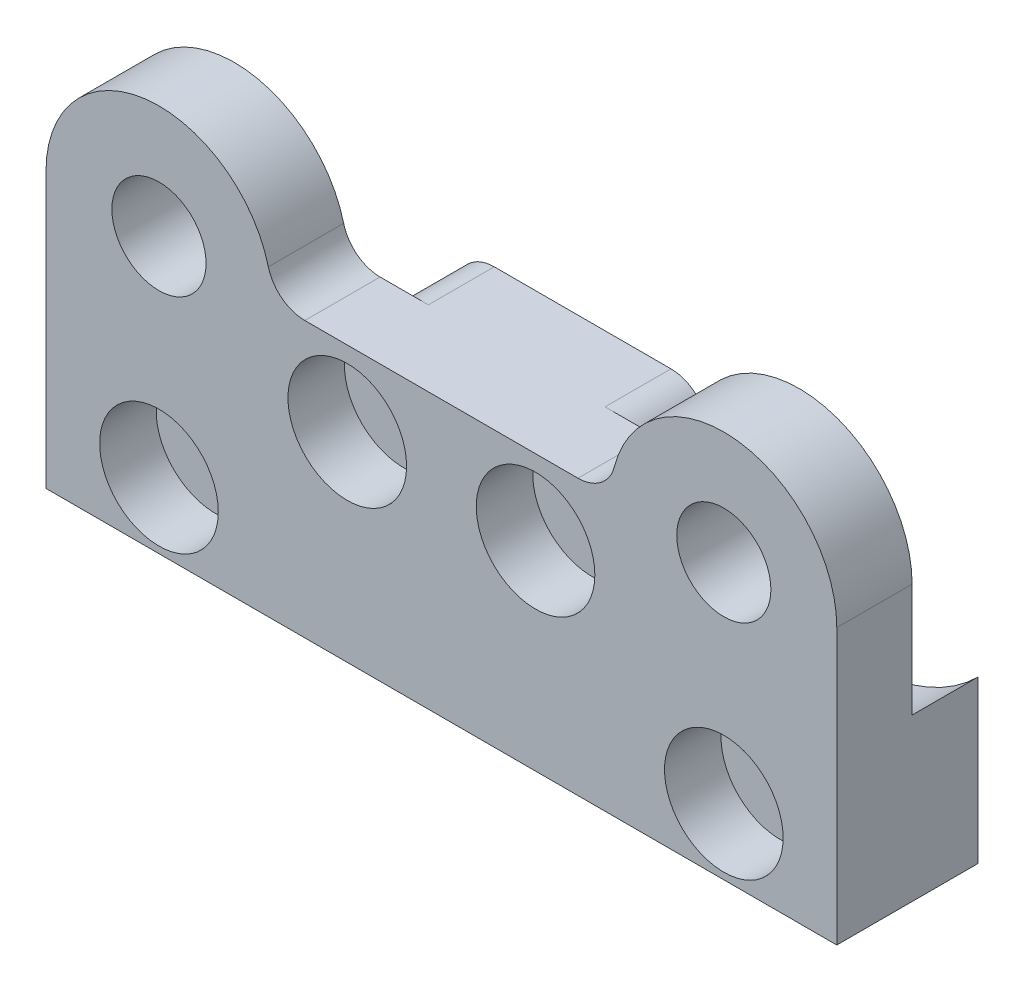
ISO-10303-21;
HEADER;
FILE_DESCRIPTION(('STEP AP214'),'2;1');
FILE_NAME('part.step','',(''),(''),'','','');
FILE_SCHEMA(('AUTOMOTIVE_DESIGN { 1 0 10303 214 1 1 1 1 }'));
ENDSEC;
DATA;
#1=APPLICATION_CONTEXT('core data for automotive mechanical design processes');
#2=APPLICATION_PROTOCOL_DEFINITION('international standard','automotive_design',2000,#1);
#3=PRODUCT_CONTEXT('',#1,'mechanical');
#4=PRODUCT('Part','Part','',(#3));
#5=PRODUCT_RELATED_PRODUCT_CATEGORY('part','',(#4));
#6=PRODUCT_DEFINITION_FORMATION('','',#4);
#7=PRODUCT_DEFINITION_CONTEXT('part definition',#1,'design');
#8=PRODUCT_DEFINITION('design','',#6,#7);
#9=PRODUCT_DEFINITION_SHAPE('','',#8);
#10=(LENGTH_UNIT() NAMED_UNIT(*) SI_UNIT(.MILLI.,.METRE.));
#11=(NAMED_UNIT(*) PLANE_ANGLE_UNIT() SI_UNIT($,.RADIAN.));
#12=(NAMED_UNIT(*) SI_UNIT($,.STERADIAN.) SOLID_ANGLE_UNIT());
#13=UNCERTAINTY_MEASURE_WITH_UNIT(LENGTH_MEASURE(1.E-05),#10,'distance_accuracy_value','');
#14=(GEOMETRIC_REPRESENTATION_CONTEXT(3) GLOBAL_UNCERTAINTY_ASSIGNED_CONTEXT((#13)) GLOBAL_UNIT_ASSIGNED_CONTEXT((#10,
#11,#12)) REPRESENTATION_CONTEXT('',''));
#15=CARTESIAN_POINT('',(0.,0.,0.));
#16=DIRECTION('',(0.,0.,1.));
#17=DIRECTION('',(1.,0.,0.));
#18=AXIS2_PLACEMENT_3D('',#15,#16,#17);
#19=CARTESIAN_POINT('',(-5.00000000000001,-45.3642357598929,4.));
#20=DIRECTION('',(0.,0.,-1.));
#21=DIRECTION('',(-1.,0.,0.));
#22=AXIS2_PLACEMENT_3D('',#19,#20,#21);
#23=CYLINDRICAL_SURFACE('',#22,1.6);
#24=CARTESIAN_POINT('',(-5.00000000000001,-45.3642357598929,-3.5));
#25=DIRECTION('',(0.,0.,-1.));
#26=DIRECTION('',(1.,0.,0.));
#27=AXIS2_PLACEMENT_3D('',#24,#25,#26);
#28=CIRCLE('',#27,1.6);
#29=CARTESIAN_POINT('',(-3.40000000000001,-45.3642357598929,-3.5));
#30=VERTEX_POINT('',#29);
#31=EDGE_CURVE('E435',#30,#30,#28,.T.);
#32=ORIENTED_EDGE('',*,*,#31,.T.);
#33=EDGE_LOOP('',(#32));
#34=FACE_BOUND('',#33,.T.);
#35=CARTESIAN_POINT('',(-5.00000000000001,-45.3642357598929,0.6));
#36=DIRECTION('',(0.,0.,1.));
#37=DIRECTION('',(1.,0.,0.));
#38=AXIS2_PLACEMENT_3D('',#35,#36,#37);
#39=CIRCLE('',#38,1.6);
#40=CARTESIAN_POINT('',(-3.40000000000001,-45.3642357598929,0.6));
#41=VERTEX_POINT('',#40);
#42=EDGE_CURVE('E11',#41,#41,#39,.F.);
#43=ORIENTED_EDGE('',*,*,#42,.F.);
#44=EDGE_LOOP('',(#43));
#45=FACE_BOUND('',#44,.T.);
#46=ADVANCED_FACE('F37',(#34,#45),#23,.F.);
#47=CARTESIAN_POINT('',(-15.,-52.4642357598929,4.));
#48=DIRECTION('',(0.,0.,-1.));
#49=DIRECTION('',(-1.,0.,0.));
#50=AXIS2_PLACEMENT_3D('',#47,#48,#49);
#51=CYLINDRICAL_SURFACE('',#50,1.60000000000001);
#52=CARTESIAN_POINT('',(-15.,-52.4642357598929,-3.5));
#53=DIRECTION('',(0.,0.,-1.));
#54=DIRECTION('',(1.,0.,0.));
#55=AXIS2_PLACEMENT_3D('',#52,#53,#54);
#56=CIRCLE('',#55,1.60000000000001);
#57=CARTESIAN_POINT('',(-13.4,-52.4642357598929,-3.5));
#58=VERTEX_POINT('',#57);
#59=EDGE_CURVE('E438',#58,#58,#56,.T.);
#60=ORIENTED_EDGE('',*,*,#59,.T.);
#61=EDGE_LOOP('',(#60));
#62=FACE_BOUND('',#61,.T.);
#63=CARTESIAN_POINT('',(-15.,-52.4642357598929,0.6));
#64=DIRECTION('',(0.,0.,1.));
#65=DIRECTION('',(1.,0.,0.));
#66=AXIS2_PLACEMENT_3D('',#63,#64,#65);
#67=CIRCLE('',#66,1.60000000000001);
#68=CARTESIAN_POINT('',(-13.4,-52.4642357598929,0.6));
#69=VERTEX_POINT('',#68);
#70=EDGE_CURVE('E45',#69,#69,#67,.F.);
#71=ORIENTED_EDGE('',*,*,#70,.F.);
#72=EDGE_LOOP('',(#71));
#73=FACE_BOUND('',#72,.T.);
#74=ADVANCED_FACE('F289',(#62,#73),#51,.F.);
#75=CARTESIAN_POINT('',(4.99999999999999,-45.3642357598929,4.));
#76=DIRECTION('',(0.,0.,-1.));
#77=DIRECTION('',(-1.,0.,0.));
#78=AXIS2_PLACEMENT_3D('',#75,#76,#77);
#79=CYLINDRICAL_SURFACE('',#78,1.6);
#80=CARTESIAN_POINT('',(4.99999999999999,-45.3642357598929,-3.5));
#81=DIRECTION('',(0.,0.,-1.));
#82=DIRECTION('',(-1.,0.,0.));
#83=AXIS2_PLACEMENT_3D('',#80,#81,#82);
#84=CIRCLE('',#83,1.6);
#85=CARTESIAN_POINT('',(3.39999999999999,-45.3642357598929,-3.5));
#86=VERTEX_POINT('',#85);
#87=EDGE_CURVE('E176',#86,#86,#84,.T.);
#88=ORIENTED_EDGE('',*,*,#87,.T.);
#89=EDGE_LOOP('',(#88));
#90=FACE_BOUND('',#89,.T.);
#91=CARTESIAN_POINT('',(4.99999999999999,-45.3642357598929,0.6));
#92=DIRECTION('',(0.,0.,1.));
#93=DIRECTION('',(1.,0.,0.));
#94=AXIS2_PLACEMENT_3D('',#91,#92,#93);
#95=CIRCLE('',#94,1.6);
#96=CARTESIAN_POINT('',(6.59999999999999,-45.3642357598929,0.6));
#97=VERTEX_POINT('',#96);
#98=EDGE_CURVE('E282',#97,#97,#95,.F.);
#99=ORIENTED_EDGE('',*,*,#98,.F.);
#100=EDGE_LOOP('',(#99));
#101=FACE_BOUND('',#100,.T.);
#102=ADVANCED_FACE('F291',(#90,#101),#79,.F.);
#103=CARTESIAN_POINT('',(15.,-52.4642357598929,4.));
#104=DIRECTION('',(0.,0.,-1.));
#105=DIRECTION('',(-1.,0.,0.));
#106=AXIS2_PLACEMENT_3D('',#103,#104,#105);
#107=CYLINDRICAL_SURFACE('',#106,1.6);
#108=CARTESIAN_POINT('',(15.,-52.4642357598929,-3.5));
#109=DIRECTION('',(0.,0.,-1.));
#110=DIRECTION('',(-1.,0.,0.));
#111=AXIS2_PLACEMENT_3D('',#108,#109,#110);
#112=CIRCLE('',#111,1.6);
#113=CARTESIAN_POINT('',(13.4,-52.4642357598929,-3.5));
#114=VERTEX_POINT('',#113);
#115=EDGE_CURVE('E434',#114,#114,#112,.T.);
#116=ORIENTED_EDGE('',*,*,#115,.T.);
#117=EDGE_LOOP('',(#116));
#118=FACE_BOUND('',#117,.T.);
#119=CARTESIAN_POINT('',(15.,-52.4642357598929,0.6));
#120=DIRECTION('',(0.,0.,1.));
#121=DIRECTION('',(1.,0.,0.));
#122=AXIS2_PLACEMENT_3D('',#119,#120,#121);
#123=CIRCLE('',#122,1.6);
#124=CARTESIAN_POINT('',(16.6,-52.4642357598929,0.6));
#125=VERTEX_POINT('',#124);
#126=EDGE_CURVE('E279',#125,#125,#123,.F.);
#127=ORIENTED_EDGE('',*,*,#126,.F.);
#128=EDGE_LOOP('',(#127));
#129=FACE_BOUND('',#128,.T.);
#130=ADVANCED_FACE('F298',(#118,#129),#107,.F.);
#131=CARTESIAN_POINT('',(0.,0.,0.));
#132=DIRECTION('',(0.,0.,1.));
#133=DIRECTION('',(1.,0.,0.));
#134=AXIS2_PLACEMENT_3D('',#131,#132,#133);
#135=PLANE('',#134);
#136=CARTESIAN_POINT('',(-15.,-41.3642357598929,0.));
#137=DIRECTION('',(0.,0.,1.));
#138=DIRECTION('',(1.,0.,0.));
#139=AXIS2_PLACEMENT_3D('',#136,#137,#138);
#140=CIRCLE('',#139,4.25);
#141=CARTESIAN_POINT('',(-10.75,-41.3642357598929,0.));
#142=VERTEX_POINT('',#141);
#143=EDGE_CURVE('E231',#142,#142,#140,.F.);
#144=ORIENTED_EDGE('',*,*,#143,.F.);
#145=EDGE_LOOP('',(#144));
#146=FACE_BOUND('',#145,.T.);
#147=CARTESIAN_POINT('',(-15.,-41.3642357598929,0.));
#148=DIRECTION('',(0.,0.,1.));
#149=DIRECTION('',(1.,0.,0.));
#150=AXIS2_PLACEMENT_3D('',#147,#148,#149);
#151=CIRCLE('',#150,6.);
#152=CARTESIAN_POINT('',(-21.,-41.3642357598929,0.));
#153=VERTEX_POINT('',#152);
#154=CARTESIAN_POINT('',(-9.19052498068888,-39.8642357598929,0.));
#155=VERTEX_POINT('',#154);
#156=EDGE_CURVE('E211',#153,#155,#151,.F.);
#157=ORIENTED_EDGE('',*,*,#156,.T.);
#158=CARTESIAN_POINT('',(-7.25403330758517,-39.3642357598929,0.));
#159=DIRECTION('',(0.,0.,1.));
#160=DIRECTION('',(1.,0.,0.));
#161=AXIS2_PLACEMENT_3D('',#158,#159,#160);
#162=CIRCLE('',#161,2.);
#163=CARTESIAN_POINT('',(-7.25403330758517,-41.3642357598929,0.));
#164=VERTEX_POINT('',#163);
#165=EDGE_CURVE('E272',#155,#164,#162,.T.);
#166=ORIENTED_EDGE('',*,*,#165,.T.);
#167=DIRECTION('',(1.,0.,0.));
#168=VECTOR('',#167,1.);
#169=CARTESIAN_POINT('',(0.,-41.3642357598929,0.));
#170=LINE('',#169,#168);
#171=CARTESIAN_POINT('',(-4.69223593595586,-41.3642357598929,0.));
#172=VERTEX_POINT('',#171);
#173=EDGE_CURVE('E209',#164,#172,#170,.T.);
#174=ORIENTED_EDGE('',*,*,#173,.T.);
#175=CARTESIAN_POINT('',(-4.69223593595586,-43.3642357598929,0.));
#176=DIRECTION('',(0.,0.,1.));
#177=DIRECTION('',(1.,0.,0.));
#178=AXIS2_PLACEMENT_3D('',#175,#176,#177);
#179=CIRCLE('',#178,2.);
#180=CARTESIAN_POINT('',(-6.65561956720237,-42.9832833789405,0.));
#181=VERTEX_POINT('',#180);
#182=EDGE_CURVE('E276',#172,#181,#179,.T.);
#183=ORIENTED_EDGE('',*,*,#182,.T.);
#184=CARTESIAN_POINT('',(-15.,-41.3642357598929,0.));
#185=DIRECTION('',(0.,0.,-1.));
#186=DIRECTION('',(-1.,0.,0.));
#187=AXIS2_PLACEMENT_3D('',#184,#185,#186);
#188=CIRCLE('',#187,8.5);
#189=CARTESIAN_POINT('',(-21.,-47.3850330492891,0.));
#190=VERTEX_POINT('',#189);
#191=EDGE_CURVE('E174',#181,#190,#188,.T.);
#192=ORIENTED_EDGE('',*,*,#191,.T.);
#193=DIRECTION('',(0.,-1.,0.));
#194=VECTOR('',#193,1.);
#195=CARTESIAN_POINT('',(-21.,0.,0.));
#196=LINE('',#195,#194);
#197=EDGE_CURVE('E214',#153,#190,#196,.T.);
#198=ORIENTED_EDGE('',*,*,#197,.F.);
#199=EDGE_LOOP('',(#157,#166,#174,#183,#192,#198));
#200=FACE_BOUND('',#199,.T.);
#201=ADVANCED_FACE('F342',(#146,#200),#135,.F.);
#202=CARTESIAN_POINT('',(15.,-41.3642357598929,0.));
#203=DIRECTION('',(0.,0.,1.));
#204=DIRECTION('',(1.,0.,0.));
#205=AXIS2_PLACEMENT_3D('',#202,#203,#204);
#206=CIRCLE('',#205,4.25);
#207=CARTESIAN_POINT('',(19.25,-41.3642357598929,0.));
#208=VERTEX_POINT('',#207);
#209=EDGE_CURVE('E228',#208,#208,#206,.F.);
#210=ORIENTED_EDGE('',*,*,#209,.F.);
#211=EDGE_LOOP('',(#210));
#212=FACE_BOUND('',#211,.T.);
#213=DIRECTION('',(0.,1.,0.));
#214=VECTOR('',#213,1.);
#215=CARTESIAN_POINT('',(21.,0.,0.));
#216=LINE('',#215,#214);
#217=CARTESIAN_POINT('',(21.,-47.385033049289,0.));
#218=VERTEX_POINT('',#217);
#219=CARTESIAN_POINT('',(21.,-41.3642357598929,0.));
#220=VERTEX_POINT('',#219);
#221=EDGE_CURVE('E217',#218,#220,#216,.T.);
#222=ORIENTED_EDGE('',*,*,#221,.F.);
#223=CARTESIAN_POINT('',(15.,-41.3642357598929,0.));
#224=DIRECTION('',(0.,0.,-1.));
#225=DIRECTION('',(-1.,0.,0.));
#226=AXIS2_PLACEMENT_3D('',#223,#224,#225);
#227=CIRCLE('',#226,8.5);
#228=CARTESIAN_POINT('',(6.65561956720234,-42.9832833789405,0.));
#229=VERTEX_POINT('',#228);
#230=EDGE_CURVE('E146',#218,#229,#227,.T.);
#231=ORIENTED_EDGE('',*,*,#230,.T.);
#232=CARTESIAN_POINT('',(4.69223593595584,-43.3642357598929,0.));
#233=DIRECTION('',(0.,0.,1.));
#234=DIRECTION('',(1.,0.,0.));
#235=AXIS2_PLACEMENT_3D('',#232,#233,#234);
#236=CIRCLE('',#235,2.);
#237=CARTESIAN_POINT('',(4.69223593595584,-41.3642357598929,0.));
#238=VERTEX_POINT('',#237);
#239=EDGE_CURVE('E52',#229,#238,#236,.T.);
#240=ORIENTED_EDGE('',*,*,#239,.T.);
#241=CARTESIAN_POINT('',(7.25403330758517,-41.3642357598929,0.));
#242=VERTEX_POINT('',#241);
#243=EDGE_CURVE('E185',#238,#242,#170,.T.);
#244=ORIENTED_EDGE('',*,*,#243,.T.);
#245=CARTESIAN_POINT('',(7.25403330758517,-39.3642357598929,0.));
#246=DIRECTION('',(0.,0.,1.));
#247=DIRECTION('',(1.,0.,0.));
#248=AXIS2_PLACEMENT_3D('',#245,#246,#247);
#249=CIRCLE('',#248,2.);
#250=CARTESIAN_POINT('',(9.19052498068888,-39.8642357598929,0.));
#251=VERTEX_POINT('',#250);
#252=EDGE_CURVE('E268',#242,#251,#249,.T.);
#253=ORIENTED_EDGE('',*,*,#252,.T.);
#254=CARTESIAN_POINT('',(15.,-41.3642357598929,0.));
#255=DIRECTION('',(0.,0.,1.));
#256=DIRECTION('',(1.,0.,0.));
#257=AXIS2_PLACEMENT_3D('',#254,#255,#256);
#258=CIRCLE('',#257,6.);
#259=EDGE_CURVE('E190',#220,#251,#258,.T.);
#260=ORIENTED_EDGE('',*,*,#259,.F.);
#261=EDGE_LOOP('',(#222,#231,#240,#244,#253,#260));
#262=FACE_BOUND('',#261,.T.);
#263=ADVANCED_FACE('F338',(#212,#262),#135,.F.);
#264=CARTESIAN_POINT('',(0.,-41.3642357598929,4.));
#265=DIRECTION('',(0.,1.,0.));
#266=DIRECTION('',(0.,0.,1.));
#267=AXIS2_PLACEMENT_3D('',#264,#265,#266);
#268=PLANE('',#267);
#269=DIRECTION('',(1.,0.,0.));
#270=VECTOR('',#269,1.);
#271=CARTESIAN_POINT('',(0.,-41.3642357598929,4.));
#272=LINE('',#271,#270);
#273=CARTESIAN_POINT('',(-7.25403330758517,-41.3642357598929,4.));
#274=VERTEX_POINT('',#273);
#275=CARTESIAN_POINT('',(7.25403330758517,-41.3642357598929,4.));
#276=VERTEX_POINT('',#275);
#277=EDGE_CURVE('E186',#274,#276,#272,.T.);
#278=ORIENTED_EDGE('',*,*,#277,.T.);
#279=DIRECTION('',(0.,0.,-1.));
#280=VECTOR('',#279,1.);
#281=CARTESIAN_POINT('',(7.25403330758517,-41.3642357598929,4.));
#282=LINE('',#281,#280);
#283=EDGE_CURVE('E253',#276,#242,#282,.T.);
#284=ORIENTED_EDGE('',*,*,#283,.T.);
#285=ORIENTED_EDGE('',*,*,#243,.F.);
#286=DIRECTION('',(0.,0.,1.));
#287=VECTOR('',#286,1.);
#288=CARTESIAN_POINT('',(4.69223593595584,-41.3642357598929,4.));
#289=LINE('',#288,#287);
#290=CARTESIAN_POINT('',(4.69223593595584,-41.3642357598929,-3.5));
#291=VERTEX_POINT('',#290);
#292=EDGE_CURVE('E246',#238,#291,#289,.F.);
#293=ORIENTED_EDGE('',*,*,#292,.T.);
#294=DIRECTION('',(1.,0.,0.));
#295=VECTOR('',#294,1.);
#296=CARTESIAN_POINT('',(0.,-41.3642357598929,-3.5));
#297=LINE('',#296,#295);
#298=CARTESIAN_POINT('',(-4.69223593595586,-41.3642357598929,-3.5));
#299=VERTEX_POINT('',#298);
#300=EDGE_CURVE('E164',#299,#291,#297,.T.);
#301=ORIENTED_EDGE('',*,*,#300,.F.);
#302=DIRECTION('',(0.,0.,1.));
#303=VECTOR('',#302,1.);
#304=CARTESIAN_POINT('',(-4.69223593595586,-41.3642357598929,4.));
#305=LINE('',#304,#303);
#306=EDGE_CURVE('E248',#299,#172,#305,.T.);
#307=ORIENTED_EDGE('',*,*,#306,.T.);
#308=ORIENTED_EDGE('',*,*,#173,.F.);
#309=DIRECTION('',(0.,0.,1.));
#310=VECTOR('',#309,1.);
#311=CARTESIAN_POINT('',(-7.25403330758517,-41.3642357598929,4.));
#312=LINE('',#311,#310);
#313=EDGE_CURVE('E251',#164,#274,#312,.T.);
#314=ORIENTED_EDGE('',*,*,#313,.T.);
#315=EDGE_LOOP('',(#278,#284,#285,#293,#301,#307,#308,#314));
#316=FACE_BOUND('',#315,.T.);
#317=ADVANCED_FACE('F341',(#316),#268,.T.);
#318=CARTESIAN_POINT('',(-15.,-41.3642357598929,4.));
#319=DIRECTION('',(0.,0.,-1.));
#320=DIRECTION('',(-1.,0.,0.));
#321=AXIS2_PLACEMENT_3D('',#318,#319,#320);
#322=CYLINDRICAL_SURFACE('',#321,6.);
#323=CARTESIAN_POINT('',(-15.,-41.3642357598929,4.));
#324=DIRECTION('',(0.,0.,1.));
#325=DIRECTION('',(1.,0.,0.));
#326=AXIS2_PLACEMENT_3D('',#323,#324,#325);
#327=CIRCLE('',#326,6.);
#328=CARTESIAN_POINT('',(-21.,-41.3642357598929,4.));
#329=VERTEX_POINT('',#328);
#330=CARTESIAN_POINT('',(-9.19052498068888,-39.8642357598929,4.));
#331=VERTEX_POINT('',#330);
#332=EDGE_CURVE('E189',#329,#331,#327,.F.);
#333=ORIENTED_EDGE('',*,*,#332,.T.);
#334=DIRECTION('',(0.,0.,-1.));
#335=VECTOR('',#334,1.);
#336=CARTESIAN_POINT('',(-9.19052498068888,-39.8642357598929,4.));
#337=LINE('',#336,#335);
#338=EDGE_CURVE('E258',#331,#155,#337,.T.);
#339=ORIENTED_EDGE('',*,*,#338,.T.);
#340=ORIENTED_EDGE('',*,*,#156,.F.);
#341=DIRECTION('',(0.,0.,-1.));
#342=VECTOR('',#341,1.);
#343=CARTESIAN_POINT('',(-21.,-41.3642357598929,4.));
#344=LINE('',#343,#342);
#345=EDGE_CURVE('E226',#329,#153,#344,.T.);
#346=ORIENTED_EDGE('',*,*,#345,.F.);
#347=EDGE_LOOP('',(#333,#339,#340,#346));
#348=FACE_BOUND('',#347,.T.);
#349=ADVANCED_FACE('F364',(#348),#322,.T.);
#350=CARTESIAN_POINT('',(-21.,0.,4.));
#351=DIRECTION('',(1.,0.,0.));
#352=DIRECTION('',(0.,1.,0.));
#353=AXIS2_PLACEMENT_3D('',#350,#351,#352);
#354=PLANE('',#353);
#355=ORIENTED_EDGE('',*,*,#197,.T.);
#356=DIRECTION('',(0.,0.,1.));
#357=VECTOR('',#356,1.);
#358=CARTESIAN_POINT('',(-21.,-47.3850330492891,-3.5));
#359=LINE('',#358,#357);
#360=CARTESIAN_POINT('',(-21.,-47.3850330492891,-3.5));
#361=VERTEX_POINT('',#360);
#362=EDGE_CURVE('E150',#361,#190,#359,.T.);
#363=ORIENTED_EDGE('',*,*,#362,.F.);
#364=DIRECTION('',(0.,1.,0.));
#365=VECTOR('',#364,1.);
#366=CARTESIAN_POINT('',(-21.,0.,-3.5));
#367=LINE('',#366,#365);
#368=CARTESIAN_POINT('',(-21.,-55.9642357598929,-3.5));
#369=VERTEX_POINT('',#368);
#370=EDGE_CURVE('E171',#369,#361,#367,.T.);
#371=ORIENTED_EDGE('',*,*,#370,.F.);
#372=DIRECTION('',(0.,0.,-1.));
#373=VECTOR('',#372,1.);
#374=CARTESIAN_POINT('',(-21.,-55.9642357598929,4.));
#375=LINE('',#374,#373);
#376=CARTESIAN_POINT('',(-21.,-55.9642357598929,4.));
#377=VERTEX_POINT('',#376);
#378=EDGE_CURVE('E224',#377,#369,#375,.T.);
#379=ORIENTED_EDGE('',*,*,#378,.F.);
#380=DIRECTION('',(0.,-1.,0.));
#381=VECTOR('',#380,1.);
#382=CARTESIAN_POINT('',(-21.,0.,4.));
#383=LINE('',#382,#381);
#384=EDGE_CURVE('E193',#329,#377,#383,.T.);
#385=ORIENTED_EDGE('',*,*,#384,.F.);
#386=ORIENTED_EDGE('',*,*,#345,.T.);
#387=EDGE_LOOP('',(#355,#363,#371,#379,#385,#386));
#388=FACE_BOUND('',#387,.T.);
#389=ADVANCED_FACE('F360',(#388),#354,.F.);
#390=CARTESIAN_POINT('',(0.,-55.9642357598929,4.));
#391=DIRECTION('',(0.,1.,0.));
#392=DIRECTION('',(-1.,0.,0.));
#393=AXIS2_PLACEMENT_3D('',#390,#391,#392);
#394=PLANE('',#393);
#395=ORIENTED_EDGE('',*,*,#378,.T.);
#396=DIRECTION('',(-1.,0.,0.));
#397=VECTOR('',#396,1.);
#398=CARTESIAN_POINT('',(0.,-55.9642357598929,-3.5));
#399=LINE('',#398,#397);
#400=CARTESIAN_POINT('',(21.,-55.9642357598929,-3.5));
#401=VERTEX_POINT('',#400);
#402=EDGE_CURVE('E160',#401,#369,#399,.T.);
#403=ORIENTED_EDGE('',*,*,#402,.F.);
#404=DIRECTION('',(0.,0.,-1.));
#405=VECTOR('',#404,1.);
#406=CARTESIAN_POINT('',(21.,-55.9642357598929,4.));
#407=LINE('',#406,#405);
#408=CARTESIAN_POINT('',(21.,-55.9642357598929,4.));
#409=VERTEX_POINT('',#408);
#410=EDGE_CURVE('E157',#409,#401,#407,.T.);
#411=ORIENTED_EDGE('',*,*,#410,.F.);
#412=DIRECTION('',(1.,0.,0.));
#413=VECTOR('',#412,1.);
#414=CARTESIAN_POINT('',(0.,-55.9642357598929,4.));
#415=LINE('',#414,#413);
#416=EDGE_CURVE('E195',#377,#409,#415,.T.);
#417=ORIENTED_EDGE('',*,*,#416,.F.);
#418=EDGE_LOOP('',(#395,#403,#411,#417));
#419=FACE_BOUND('',#418,.T.);
#420=ADVANCED_FACE('F357',(#419),#394,.F.);
#421=CARTESIAN_POINT('',(21.,0.,4.));
#422=DIRECTION('',(-1.,0.,0.));
#423=DIRECTION('',(0.,0.,1.));
#424=AXIS2_PLACEMENT_3D('',#421,#422,#423);
#425=PLANE('',#424);
#426=ORIENTED_EDGE('',*,*,#410,.T.);
#427=DIRECTION('',(0.,-1.,0.));
#428=VECTOR('',#427,1.);
#429=CARTESIAN_POINT('',(21.,0.,-3.5));
#430=LINE('',#429,#428);
#431=CARTESIAN_POINT('',(21.,-47.385033049289,-3.5));
#432=VERTEX_POINT('',#431);
#433=EDGE_CURVE('E153',#432,#401,#430,.T.);
#434=ORIENTED_EDGE('',*,*,#433,.F.);
#435=DIRECTION('',(0.,0.,1.));
#436=VECTOR('',#435,1.);
#437=CARTESIAN_POINT('',(21.,-47.385033049289,-3.5));
#438=LINE('',#437,#436);
#439=EDGE_CURVE('E141',#432,#218,#438,.T.);
#440=ORIENTED_EDGE('',*,*,#439,.T.);
#441=ORIENTED_EDGE('',*,*,#221,.T.);
#442=DIRECTION('',(0.,0.,-1.));
#443=VECTOR('',#442,1.);
#444=CARTESIAN_POINT('',(21.,-41.3642357598929,4.));
#445=LINE('',#444,#443);
#446=CARTESIAN_POINT('',(21.,-41.3642357598929,4.));
#447=VERTEX_POINT('',#446);
#448=EDGE_CURVE('E208',#447,#220,#445,.T.);
#449=ORIENTED_EDGE('',*,*,#448,.F.);
#450=DIRECTION('',(0.,1.,0.));
#451=VECTOR('',#450,1.);
#452=CARTESIAN_POINT('',(21.,0.,4.));
#453=LINE('',#452,#451);
#454=EDGE_CURVE('E197',#409,#447,#453,.T.);
#455=ORIENTED_EDGE('',*,*,#454,.F.);
#456=EDGE_LOOP('',(#426,#434,#440,#441,#449,#455));
#457=FACE_BOUND('',#456,.T.);
#458=ADVANCED_FACE('F154',(#457),#425,.F.);
#459=CARTESIAN_POINT('',(15.,-41.3642357598929,4.));
#460=DIRECTION('',(0.,0.,-1.));
#461=DIRECTION('',(-1.,0.,0.));
#462=AXIS2_PLACEMENT_3D('',#459,#460,#461);
#463=CYLINDRICAL_SURFACE('',#462,2.5);
#464=CARTESIAN_POINT('',(15.,-41.3642357598929,4.));
#465=DIRECTION('',(0.,0.,1.));
#466=DIRECTION('',(1.,0.,0.));
#467=AXIS2_PLACEMENT_3D('',#464,#465,#466);
#468=CIRCLE('',#467,2.5);
#469=CARTESIAN_POINT('',(17.5,-41.3642357598929,4.));
#470=VERTEX_POINT('',#469);
#471=EDGE_CURVE('E202',#470,#470,#468,.T.);
#472=ORIENTED_EDGE('',*,*,#471,.T.);
#473=EDGE_LOOP('',(#472));
#474=FACE_BOUND('',#473,.T.);
#475=CARTESIAN_POINT('',(15.,-41.3642357598929,-0.8));
#476=DIRECTION('',(0.,0.,-1.));
#477=DIRECTION('',(-1.,0.,0.));
#478=AXIS2_PLACEMENT_3D('',#475,#476,#477);
#479=CIRCLE('',#478,2.5);
#480=CARTESIAN_POINT('',(12.5,-41.3642357598929,-0.8));
#481=VERTEX_POINT('',#480);
#482=EDGE_CURVE('E182',#481,#481,#479,.T.);
#483=ORIENTED_EDGE('',*,*,#482,.T.);
#484=EDGE_LOOP('',(#483));
#485=FACE_BOUND('',#484,.T.);
#486=ADVANCED_FACE('F348',(#474,#485),#463,.F.);
#487=CARTESIAN_POINT('',(15.,-41.3642357598929,4.));
#488=DIRECTION('',(0.,0.,-1.));
#489=DIRECTION('',(-1.,0.,0.));
#490=AXIS2_PLACEMENT_3D('',#487,#488,#489);
#491=CYLINDRICAL_SURFACE('',#490,6.);
#492=ORIENTED_EDGE('',*,*,#259,.T.);
#493=DIRECTION('',(0.,0.,-1.));
#494=VECTOR('',#493,1.);
#495=CARTESIAN_POINT('',(9.19052498068888,-39.8642357598929,4.));
#496=LINE('',#495,#494);
#497=CARTESIAN_POINT('',(9.19052498068888,-39.8642357598929,4.));
#498=VERTEX_POINT('',#497);
#499=EDGE_CURVE('E256',#251,#498,#496,.F.);
#500=ORIENTED_EDGE('',*,*,#499,.T.);
#501=CARTESIAN_POINT('',(15.,-41.3642357598929,4.));
#502=DIRECTION('',(0.,0.,1.));
#503=DIRECTION('',(1.,0.,0.));
#504=AXIS2_PLACEMENT_3D('',#501,#502,#503);
#505=CIRCLE('',#504,6.);
#506=EDGE_CURVE('E199',#447,#498,#505,.T.);
#507=ORIENTED_EDGE('',*,*,#506,.F.);
#508=ORIENTED_EDGE('',*,*,#448,.T.);
#509=EDGE_LOOP('',(#492,#500,#507,#508));
#510=FACE_BOUND('',#509,.T.);
#511=ADVANCED_FACE('F346',(#510),#491,.T.);
#512=CARTESIAN_POINT('',(-15.,-41.3642357598929,4.));
#513=DIRECTION('',(0.,0.,-1.));
#514=DIRECTION('',(-1.,0.,0.));
#515=AXIS2_PLACEMENT_3D('',#512,#513,#514);
#516=CYLINDRICAL_SURFACE('',#515,2.5);
#517=CARTESIAN_POINT('',(-15.,-41.3642357598929,4.));
#518=DIRECTION('',(0.,0.,1.));
#519=DIRECTION('',(1.,0.,0.));
#520=AXIS2_PLACEMENT_3D('',#517,#518,#519);
#521=CIRCLE('',#520,2.5);
#522=CARTESIAN_POINT('',(-12.5,-41.3642357598929,4.));
#523=VERTEX_POINT('',#522);
#524=EDGE_CURVE('E205',#523,#523,#521,.F.);
#525=ORIENTED_EDGE('',*,*,#524,.F.);
#526=EDGE_LOOP('',(#525));
#527=FACE_BOUND('',#526,.T.);
#528=CARTESIAN_POINT('',(-15.,-41.3642357598929,-0.8));
#529=DIRECTION('',(0.,0.,-1.));
#530=DIRECTION('',(-1.,0.,0.));
#531=AXIS2_PLACEMENT_3D('',#528,#529,#530);
#532=CIRCLE('',#531,2.5);
#533=CARTESIAN_POINT('',(-17.5,-41.3642357598929,-0.8));
#534=VERTEX_POINT('',#533);
#535=EDGE_CURVE('E149',#534,#534,#532,.T.);
#536=ORIENTED_EDGE('',*,*,#535,.T.);
#537=EDGE_LOOP('',(#536));
#538=FACE_BOUND('',#537,.T.);
#539=ADVANCED_FACE('F336',(#527,#538),#516,.F.);
#540=CARTESIAN_POINT('',(0.,0.,4.));
#541=DIRECTION('',(0.,0.,1.));
#542=DIRECTION('',(1.,0.,0.));
#543=AXIS2_PLACEMENT_3D('',#540,#541,#542);
#544=PLANE('',#543);
#545=CARTESIAN_POINT('',(-15.,-52.4642357598929,4.));
#546=DIRECTION('',(0.,0.,1.));
#547=DIRECTION('',(1.,0.,0.));
#548=AXIS2_PLACEMENT_3D('',#545,#546,#547);
#549=CIRCLE('',#548,3.15);
#550=CARTESIAN_POINT('',(-11.85,-52.4642357598929,4.));
#551=VERTEX_POINT('',#550);
#552=EDGE_CURVE('E449',#551,#551,#549,.T.);
#553=ORIENTED_EDGE('',*,*,#552,.F.);
#554=EDGE_LOOP('',(#553));
#555=FACE_BOUND('',#554,.T.);
#556=CARTESIAN_POINT('',(15.,-52.4642357598929,4.));
#557=DIRECTION('',(0.,0.,1.));
#558=DIRECTION('',(1.,0.,0.));
#559=AXIS2_PLACEMENT_3D('',#556,#557,#558);
#560=CIRCLE('',#559,3.15);
#561=CARTESIAN_POINT('',(18.15,-52.4642357598929,4.));
#562=VERTEX_POINT('',#561);
#563=EDGE_CURVE('E455',#562,#562,#560,.T.);
#564=ORIENTED_EDGE('',*,*,#563,.F.);
#565=EDGE_LOOP('',(#564));
#566=FACE_BOUND('',#565,.T.);
#567=CARTESIAN_POINT('',(4.99999999999999,-45.3642357598929,4.));
#568=DIRECTION('',(0.,0.,1.));
#569=DIRECTION('',(1.,0.,0.));
#570=AXIS2_PLACEMENT_3D('',#567,#568,#569);
#571=CIRCLE('',#570,3.15);
#572=CARTESIAN_POINT('',(8.14999999999999,-45.3642357598929,4.));
#573=VERTEX_POINT('',#572);
#574=EDGE_CURVE('E461',#573,#573,#571,.T.);
#575=ORIENTED_EDGE('',*,*,#574,.F.);
#576=EDGE_LOOP('',(#575));
#577=FACE_BOUND('',#576,.T.);
#578=CARTESIAN_POINT('',(-5.00000000000001,-45.3642357598929,4.));
#579=DIRECTION('',(0.,0.,1.));
#580=DIRECTION('',(1.,0.,0.));
#581=AXIS2_PLACEMENT_3D('',#578,#579,#580);
#582=CIRCLE('',#581,3.15);
#583=CARTESIAN_POINT('',(-1.85000000000001,-45.3642357598929,4.));
#584=VERTEX_POINT('',#583);
#585=EDGE_CURVE('E443',#584,#584,#582,.T.);
#586=ORIENTED_EDGE('',*,*,#585,.F.);
#587=EDGE_LOOP('',(#586));
#588=FACE_BOUND('',#587,.T.);
#589=ORIENTED_EDGE('',*,*,#277,.F.);
#590=CARTESIAN_POINT('',(-7.25403330758517,-39.3642357598929,4.));
#591=DIRECTION('',(0.,0.,1.));
#592=DIRECTION('',(1.,0.,0.));
#593=AXIS2_PLACEMENT_3D('',#590,#591,#592);
#594=CIRCLE('',#593,2.);
#595=EDGE_CURVE('E274',#274,#331,#594,.F.);
#596=ORIENTED_EDGE('',*,*,#595,.T.);
#597=ORIENTED_EDGE('',*,*,#332,.F.);
#598=ORIENTED_EDGE('',*,*,#384,.T.);
#599=ORIENTED_EDGE('',*,*,#416,.T.);
#600=ORIENTED_EDGE('',*,*,#454,.T.);
#601=ORIENTED_EDGE('',*,*,#506,.T.);
#602=CARTESIAN_POINT('',(7.25403330758517,-39.3642357598929,4.));
#603=DIRECTION('',(0.,0.,1.));
#604=DIRECTION('',(1.,0.,0.));
#605=AXIS2_PLACEMENT_3D('',#602,#603,#604);
#606=CIRCLE('',#605,2.);
#607=EDGE_CURVE('E270',#498,#276,#606,.F.);
#608=ORIENTED_EDGE('',*,*,#607,.T.);
#609=EDGE_LOOP('',(#589,#596,#597,#598,#599,#600,#601,#608));
#610=FACE_BOUND('',#609,.T.);
#611=ORIENTED_EDGE('',*,*,#471,.F.);
#612=EDGE_LOOP('',(#611));
#613=FACE_BOUND('',#612,.T.);
#614=ORIENTED_EDGE('',*,*,#524,.T.);
#615=EDGE_LOOP('',(#614));
#616=FACE_BOUND('',#615,.T.);
#617=ADVANCED_FACE('F329',(#555,#566,#577,#588,#610,#613,#616),#544,.T.);
#618=CARTESIAN_POINT('',(15.,-41.3642357598929,-0.8));
#619=DIRECTION('',(0.,0.,-1.));
#620=DIRECTION('',(-1.,0.,0.));
#621=AXIS2_PLACEMENT_3D('',#618,#619,#620);
#622=PLANE('',#621);
#623=CARTESIAN_POINT('',(15.,-41.3642357598929,-0.8));
#624=DIRECTION('',(0.,0.,-1.));
#625=DIRECTION('',(-1.,0.,0.));
#626=AXIS2_PLACEMENT_3D('',#623,#624,#625);
#627=CIRCLE('',#626,3.75);
#628=CARTESIAN_POINT('',(11.25,-41.3642357598929,-0.8));
#629=VERTEX_POINT('',#628);
#630=EDGE_CURVE('E234',#629,#629,#627,.T.);
#631=ORIENTED_EDGE('',*,*,#630,.T.);
#632=EDGE_LOOP('',(#631));
#633=FACE_BOUND('',#632,.T.);
#634=ORIENTED_EDGE('',*,*,#482,.F.);
#635=EDGE_LOOP('',(#634));
#636=FACE_BOUND('',#635,.T.);
#637=ADVANCED_FACE('F326',(#633,#636),#622,.T.);
#638=CARTESIAN_POINT('',(15.,-41.3642357598929,-0.8));
#639=DIRECTION('',(0.,0.,1.));
#640=DIRECTION('',(1.,0.,0.));
#641=AXIS2_PLACEMENT_3D('',#638,#639,#640);
#642=CYLINDRICAL_SURFACE('',#641,4.25);
#643=CARTESIAN_POINT('',(15.,-41.3642357598929,-0.3));
#644=DIRECTION('',(0.,0.,-1.));
#645=DIRECTION('',(-1.,0.,0.));
#646=AXIS2_PLACEMENT_3D('',#643,#644,#645);
#647=CIRCLE('',#646,4.25);
#648=CARTESIAN_POINT('',(10.75,-41.3642357598929,-0.3));
#649=VERTEX_POINT('',#648);
#650=EDGE_CURVE('E237',#649,#649,#647,.F.);
#651=ORIENTED_EDGE('',*,*,#650,.T.);
#652=EDGE_LOOP('',(#651));
#653=FACE_BOUND('',#652,.T.);
#654=ORIENTED_EDGE('',*,*,#209,.T.);
#655=EDGE_LOOP('',(#654));
#656=FACE_BOUND('',#655,.T.);
#657=ADVANCED_FACE('F321',(#653,#656),#642,.T.);
#658=CARTESIAN_POINT('',(-15.,-41.3642357598929,-0.8));
#659=DIRECTION('',(0.,0.,-1.));
#660=DIRECTION('',(-1.,0.,0.));
#661=AXIS2_PLACEMENT_3D('',#658,#659,#660);
#662=PLANE('',#661);
#663=CARTESIAN_POINT('',(-15.,-41.3642357598929,-0.8));
#664=DIRECTION('',(0.,0.,-1.));
#665=DIRECTION('',(-1.,0.,0.));
#666=AXIS2_PLACEMENT_3D('',#663,#664,#665);
#667=CIRCLE('',#666,3.74999999999999);
#668=CARTESIAN_POINT('',(-18.75,-41.3642357598929,-0.8));
#669=VERTEX_POINT('',#668);
#670=EDGE_CURVE('E240',#669,#669,#667,.T.);
#671=ORIENTED_EDGE('',*,*,#670,.T.);
#672=EDGE_LOOP('',(#671));
#673=FACE_BOUND('',#672,.T.);
#674=ORIENTED_EDGE('',*,*,#535,.F.);
#675=EDGE_LOOP('',(#674));
#676=FACE_BOUND('',#675,.T.);
#677=ADVANCED_FACE('F318',(#673,#676),#662,.T.);
#678=CARTESIAN_POINT('',(-15.,-41.3642357598929,-0.8));
#679=DIRECTION('',(0.,0.,1.));
#680=DIRECTION('',(1.,0.,0.));
#681=AXIS2_PLACEMENT_3D('',#678,#679,#680);
#682=CYLINDRICAL_SURFACE('',#681,4.25);
#683=CARTESIAN_POINT('',(-15.,-41.3642357598929,-0.299999999999989));
#684=DIRECTION('',(0.,0.,-1.));
#685=DIRECTION('',(-1.,0.,0.));
#686=AXIS2_PLACEMENT_3D('',#683,#684,#685);
#687=CIRCLE('',#686,4.25);
#688=CARTESIAN_POINT('',(-19.25,-41.3642357598929,-0.299999999999989));
#689=VERTEX_POINT('',#688);
#690=EDGE_CURVE('E243',#689,#689,#687,.F.);
#691=ORIENTED_EDGE('',*,*,#690,.T.);
#692=EDGE_LOOP('',(#691));
#693=FACE_BOUND('',#692,.T.);
#694=ORIENTED_EDGE('',*,*,#143,.T.);
#695=EDGE_LOOP('',(#694));
#696=FACE_BOUND('',#695,.T.);
#697=ADVANCED_FACE('F316',(#693,#696),#682,.T.);
#698=CARTESIAN_POINT('',(-15.,-41.3642357598929,-3.5));
#699=DIRECTION('',(0.,0.,1.));
#700=DIRECTION('',(1.,0.,0.));
#701=AXIS2_PLACEMENT_3D('',#698,#699,#700);
#702=CYLINDRICAL_SURFACE('',#701,8.5);
#703=ORIENTED_EDGE('',*,*,#191,.F.);
#704=DIRECTION('',(0.,0.,1.));
#705=VECTOR('',#704,1.);
#706=CARTESIAN_POINT('',(-6.65561956720237,-42.9832833789405,-3.5));
#707=LINE('',#706,#705);
#708=CARTESIAN_POINT('',(-6.65561956720237,-42.9832833789405,-3.5));
#709=VERTEX_POINT('',#708);
#710=EDGE_CURVE('E261',#181,#709,#707,.F.);
#711=ORIENTED_EDGE('',*,*,#710,.T.);
#712=CARTESIAN_POINT('',(-15.,-41.3642357598929,-3.5));
#713=DIRECTION('',(0.,0.,-1.));
#714=DIRECTION('',(-1.,0.,0.));
#715=AXIS2_PLACEMENT_3D('',#712,#713,#714);
#716=CIRCLE('',#715,8.5);
#717=EDGE_CURVE('E166',#709,#361,#716,.T.);
#718=ORIENTED_EDGE('',*,*,#717,.T.);
#719=ORIENTED_EDGE('',*,*,#362,.T.);
#720=EDGE_LOOP('',(#703,#711,#718,#719));
#721=FACE_BOUND('',#720,.T.);
#722=ADVANCED_FACE('F313',(#721),#702,.F.);
#723=CARTESIAN_POINT('',(15.,-41.3642357598929,-3.5));
#724=DIRECTION('',(0.,0.,1.));
#725=DIRECTION('',(1.,0.,0.));
#726=AXIS2_PLACEMENT_3D('',#723,#724,#725);
#727=CYLINDRICAL_SURFACE('',#726,8.5);
#728=CARTESIAN_POINT('',(15.,-41.3642357598929,-3.5));
#729=DIRECTION('',(0.,0.,-1.));
#730=DIRECTION('',(-1.,0.,0.));
#731=AXIS2_PLACEMENT_3D('',#728,#729,#730);
#732=CIRCLE('',#731,8.5);
#733=CARTESIAN_POINT('',(6.65561956720234,-42.9832833789405,-3.5));
#734=VERTEX_POINT('',#733);
#735=EDGE_CURVE('E144',#432,#734,#732,.T.);
#736=ORIENTED_EDGE('',*,*,#735,.T.);
#737=DIRECTION('',(0.,0.,1.));
#738=VECTOR('',#737,1.);
#739=CARTESIAN_POINT('',(6.65561956720234,-42.9832833789405,-3.5));
#740=LINE('',#739,#738);
#741=EDGE_CURVE('E266',#734,#229,#740,.T.);
#742=ORIENTED_EDGE('',*,*,#741,.T.);
#743=ORIENTED_EDGE('',*,*,#230,.F.);
#744=ORIENTED_EDGE('',*,*,#439,.F.);
#745=EDGE_LOOP('',(#736,#742,#743,#744));
#746=FACE_BOUND('',#745,.T.);
#747=ADVANCED_FACE('F143',(#746),#727,.F.);
#748=CARTESIAN_POINT('',(0.,0.,-3.5));
#749=DIRECTION('',(0.,0.,-1.));
#750=DIRECTION('',(-1.,0.,0.));
#751=AXIS2_PLACEMENT_3D('',#748,#749,#750);
#752=PLANE('',#751);
#753=ORIENTED_EDGE('',*,*,#31,.F.);
#754=EDGE_LOOP('',(#753));
#755=FACE_BOUND('',#754,.T.);
#756=ORIENTED_EDGE('',*,*,#59,.F.);
#757=EDGE_LOOP('',(#756));
#758=FACE_BOUND('',#757,.T.);
#759=ORIENTED_EDGE('',*,*,#115,.F.);
#760=EDGE_LOOP('',(#759));
#761=FACE_BOUND('',#760,.T.);
#762=ORIENTED_EDGE('',*,*,#87,.F.);
#763=EDGE_LOOP('',(#762));
#764=FACE_BOUND('',#763,.T.);
#765=ORIENTED_EDGE('',*,*,#717,.F.);
#766=CARTESIAN_POINT('',(-4.69223593595586,-43.3642357598929,-3.5));
#767=DIRECTION('',(0.,0.,-1.));
#768=DIRECTION('',(-1.,0.,0.));
#769=AXIS2_PLACEMENT_3D('',#766,#767,#768);
#770=CIRCLE('',#769,2.);
#771=EDGE_CURVE('E264',#709,#299,#770,.T.);
#772=ORIENTED_EDGE('',*,*,#771,.T.);
#773=ORIENTED_EDGE('',*,*,#300,.T.);
#774=CARTESIAN_POINT('',(4.69223593595584,-43.3642357598929,-3.5));
#775=DIRECTION('',(0.,0.,-1.));
#776=DIRECTION('',(-1.,0.,0.));
#777=AXIS2_PLACEMENT_3D('',#774,#775,#776);
#778=CIRCLE('',#777,2.);
#779=EDGE_CURVE('E60',#291,#734,#778,.T.);
#780=ORIENTED_EDGE('',*,*,#779,.T.);
#781=ORIENTED_EDGE('',*,*,#735,.F.);
#782=ORIENTED_EDGE('',*,*,#433,.T.);
#783=ORIENTED_EDGE('',*,*,#402,.T.);
#784=ORIENTED_EDGE('',*,*,#370,.T.);
#785=EDGE_LOOP('',(#765,#772,#773,#780,#781,#782,#783,#784));
#786=FACE_BOUND('',#785,.T.);
#787=ADVANCED_FACE('F163',(#755,#758,#761,#764,#786),#752,.T.);
#788=CARTESIAN_POINT('',(-5.00000000000001,-45.3642357598929,1.));
#789=DIRECTION('',(0.,0.,1.));
#790=DIRECTION('',(1.,0.,0.));
#791=AXIS2_PLACEMENT_3D('',#788,#789,#790);
#792=PLANE('',#791);
#793=CARTESIAN_POINT('',(-5.00000000000001,-45.3642357598929,1.));
#794=DIRECTION('',(0.,0.,1.));
#795=DIRECTION('',(1.,0.,0.));
#796=AXIS2_PLACEMENT_3D('',#793,#794,#795);
#797=CIRCLE('',#796,3.15);
#798=CARTESIAN_POINT('',(-1.85000000000001,-45.3642357598929,1.));
#799=VERTEX_POINT('',#798);
#800=EDGE_CURVE('E439',#799,#799,#797,.T.);
#801=ORIENTED_EDGE('',*,*,#800,.T.);
#802=EDGE_LOOP('',(#801));
#803=FACE_BOUND('',#802,.T.);
#804=ADVANCED_FACE('F309',(#803),#792,.T.);
#805=CARTESIAN_POINT('',(-5.00000000000001,-45.3642357598929,1.));
#806=DIRECTION('',(0.,0.,1.));
#807=DIRECTION('',(1.,0.,0.));
#808=AXIS2_PLACEMENT_3D('',#805,#806,#807);
#809=CYLINDRICAL_SURFACE('',#808,3.15);
#810=ORIENTED_EDGE('',*,*,#800,.F.);
#811=EDGE_LOOP('',(#810));
#812=FACE_BOUND('',#811,.T.);
#813=ORIENTED_EDGE('',*,*,#585,.T.);
#814=EDGE_LOOP('',(#813));
#815=FACE_BOUND('',#814,.T.);
#816=ADVANCED_FACE('F477',(#812,#815),#809,.F.);
#817=CARTESIAN_POINT('',(-15.,-52.4642357598929,1.));
#818=DIRECTION('',(0.,0.,1.));
#819=DIRECTION('',(1.,0.,0.));
#820=AXIS2_PLACEMENT_3D('',#817,#818,#819);
#821=PLANE('',#820);
#822=CARTESIAN_POINT('',(-15.,-52.4642357598929,1.));
#823=DIRECTION('',(0.,0.,1.));
#824=DIRECTION('',(1.,0.,0.));
#825=AXIS2_PLACEMENT_3D('',#822,#823,#824);
#826=CIRCLE('',#825,3.15);
#827=CARTESIAN_POINT('',(-11.85,-52.4642357598929,1.));
#828=VERTEX_POINT('',#827);
#829=EDGE_CURVE('E452',#828,#828,#826,.T.);
#830=ORIENTED_EDGE('',*,*,#829,.T.);
#831=EDGE_LOOP('',(#830));
#832=FACE_BOUND('',#831,.T.);
#833=ADVANCED_FACE('F479',(#832),#821,.T.);
#834=CARTESIAN_POINT('',(-15.,-52.4642357598929,1.));
#835=DIRECTION('',(0.,0.,1.));
#836=DIRECTION('',(1.,0.,0.));
#837=AXIS2_PLACEMENT_3D('',#834,#835,#836);
#838=CYLINDRICAL_SURFACE('',#837,3.15);
#839=ORIENTED_EDGE('',*,*,#829,.F.);
#840=EDGE_LOOP('',(#839));
#841=FACE_BOUND('',#840,.T.);
#842=ORIENTED_EDGE('',*,*,#552,.T.);
#843=EDGE_LOOP('',(#842));
#844=FACE_BOUND('',#843,.T.);
#845=ADVANCED_FACE('F485',(#841,#844),#838,.F.);
#846=CARTESIAN_POINT('',(15.,-52.4642357598929,1.));
#847=DIRECTION('',(0.,0.,1.));
#848=DIRECTION('',(1.,0.,0.));
#849=AXIS2_PLACEMENT_3D('',#846,#847,#848);
#850=PLANE('',#849);
#851=CARTESIAN_POINT('',(15.,-52.4642357598929,1.));
#852=DIRECTION('',(0.,0.,1.));
#853=DIRECTION('',(1.,0.,0.));
#854=AXIS2_PLACEMENT_3D('',#851,#852,#853);
#855=CIRCLE('',#854,3.15);
#856=CARTESIAN_POINT('',(18.15,-52.4642357598929,1.));
#857=VERTEX_POINT('',#856);
#858=EDGE_CURVE('E458',#857,#857,#855,.T.);
#859=ORIENTED_EDGE('',*,*,#858,.T.);
#860=EDGE_LOOP('',(#859));
#861=FACE_BOUND('',#860,.T.);
#862=ADVANCED_FACE('F493',(#861),#850,.T.);
#863=CARTESIAN_POINT('',(15.,-52.4642357598929,1.));
#864=DIRECTION('',(0.,0.,1.));
#865=DIRECTION('',(1.,0.,0.));
#866=AXIS2_PLACEMENT_3D('',#863,#864,#865);
#867=CYLINDRICAL_SURFACE('',#866,3.15);
#868=ORIENTED_EDGE('',*,*,#858,.F.);
#869=EDGE_LOOP('',(#868));
#870=FACE_BOUND('',#869,.T.);
#871=ORIENTED_EDGE('',*,*,#563,.T.);
#872=EDGE_LOOP('',(#871));
#873=FACE_BOUND('',#872,.T.);
#874=ADVANCED_FACE('F496',(#870,#873),#867,.F.);
#875=CARTESIAN_POINT('',(4.99999999999999,-45.3642357598929,1.));
#876=DIRECTION('',(0.,0.,1.));
#877=DIRECTION('',(1.,0.,0.));
#878=AXIS2_PLACEMENT_3D('',#875,#876,#877);
#879=PLANE('',#878);
#880=CARTESIAN_POINT('',(4.99999999999999,-45.3642357598929,1.));
#881=DIRECTION('',(0.,0.,1.));
#882=DIRECTION('',(1.,0.,0.));
#883=AXIS2_PLACEMENT_3D('',#880,#881,#882);
#884=CIRCLE('',#883,3.15);
#885=CARTESIAN_POINT('',(8.14999999999999,-45.3642357598929,1.));
#886=VERTEX_POINT('',#885);
#887=EDGE_CURVE('E446',#886,#886,#884,.T.);
#888=ORIENTED_EDGE('',*,*,#887,.T.);
#889=EDGE_LOOP('',(#888));
#890=FACE_BOUND('',#889,.T.);
#891=ADVANCED_FACE('F467',(#890),#879,.T.);
#892=CARTESIAN_POINT('',(4.99999999999999,-45.3642357598929,1.));
#893=DIRECTION('',(0.,0.,1.));
#894=DIRECTION('',(1.,0.,0.));
#895=AXIS2_PLACEMENT_3D('',#892,#893,#894);
#896=CYLINDRICAL_SURFACE('',#895,3.15);
#897=ORIENTED_EDGE('',*,*,#887,.F.);
#898=EDGE_LOOP('',(#897));
#899=FACE_BOUND('',#898,.T.);
#900=ORIENTED_EDGE('',*,*,#574,.T.);
#901=EDGE_LOOP('',(#900));
#902=FACE_BOUND('',#901,.T.);
#903=ADVANCED_FACE('F380',(#899,#902),#896,.F.);
#904=CARTESIAN_POINT('',(15.,-41.3642357598929,-0.8));
#905=DIRECTION('',(0.,0.,1.));
#906=DIRECTION('',(1.,0.,0.));
#907=AXIS2_PLACEMENT_3D('',#904,#905,#906);
#908=CONICAL_SURFACE('',#907,3.75,0.785398163397444);
#909=ORIENTED_EDGE('',*,*,#650,.F.);
#910=EDGE_LOOP('',(#909));
#911=FACE_BOUND('',#910,.T.);
#912=ORIENTED_EDGE('',*,*,#630,.F.);
#913=EDGE_LOOP('',(#912));
#914=FACE_BOUND('',#913,.T.);
#915=ADVANCED_FACE('F373',(#911,#914),#908,.T.);
#916=CARTESIAN_POINT('',(-15.,-41.3642357598929,-0.8));
#917=DIRECTION('',(0.,0.,1.));
#918=DIRECTION('',(1.,0.,0.));
#919=AXIS2_PLACEMENT_3D('',#916,#917,#918);
#920=CONICAL_SURFACE('',#919,3.74999999999999,0.785398163397442);
#921=ORIENTED_EDGE('',*,*,#690,.F.);
#922=EDGE_LOOP('',(#921));
#923=FACE_BOUND('',#922,.T.);
#924=ORIENTED_EDGE('',*,*,#670,.F.);
#925=EDGE_LOOP('',(#924));
#926=FACE_BOUND('',#925,.T.);
#927=ADVANCED_FACE('F379',(#923,#926),#920,.T.);
#928=CARTESIAN_POINT('',(7.25403330758517,-39.3642357598929,4.));
#929=DIRECTION('',(0.,0.,-1.));
#930=DIRECTION('',(-1.,0.,0.));
#931=AXIS2_PLACEMENT_3D('',#928,#929,#930);
#932=CYLINDRICAL_SURFACE('',#931,2.);
#933=ORIENTED_EDGE('',*,*,#607,.F.);
#934=ORIENTED_EDGE('',*,*,#499,.F.);
#935=ORIENTED_EDGE('',*,*,#252,.F.);
#936=ORIENTED_EDGE('',*,*,#283,.F.);
#937=EDGE_LOOP('',(#933,#934,#935,#936));
#938=FACE_BOUND('',#937,.T.);
#939=ADVANCED_FACE('F386',(#938),#932,.F.);
#940=CARTESIAN_POINT('',(-7.25403330758517,-39.3642357598929,4.));
#941=DIRECTION('',(0.,0.,-1.));
#942=DIRECTION('',(-1.,0.,0.));
#943=AXIS2_PLACEMENT_3D('',#940,#941,#942);
#944=CYLINDRICAL_SURFACE('',#943,2.);
#945=ORIENTED_EDGE('',*,*,#595,.F.);
#946=ORIENTED_EDGE('',*,*,#313,.F.);
#947=ORIENTED_EDGE('',*,*,#165,.F.);
#948=ORIENTED_EDGE('',*,*,#338,.F.);
#949=EDGE_LOOP('',(#945,#946,#947,#948));
#950=FACE_BOUND('',#949,.T.);
#951=ADVANCED_FACE('F390',(#950),#944,.F.);
#952=CARTESIAN_POINT('',(-4.69223593595586,-43.3642357598929,-3.5));
#953=DIRECTION('',(0.,0.,1.));
#954=DIRECTION('',(1.,0.,0.));
#955=AXIS2_PLACEMENT_3D('',#952,#953,#954);
#956=CYLINDRICAL_SURFACE('',#955,2.);
#957=ORIENTED_EDGE('',*,*,#771,.F.);
#958=ORIENTED_EDGE('',*,*,#710,.F.);
#959=ORIENTED_EDGE('',*,*,#182,.F.);
#960=ORIENTED_EDGE('',*,*,#306,.F.);
#961=EDGE_LOOP('',(#957,#958,#959,#960));
#962=FACE_BOUND('',#961,.T.);
#963=ADVANCED_FACE('F393',(#962),#956,.T.);
#964=CARTESIAN_POINT('',(4.69223593595584,-43.3642357598929,-3.5));
#965=DIRECTION('',(0.,0.,1.));
#966=DIRECTION('',(1.,0.,0.));
#967=AXIS2_PLACEMENT_3D('',#964,#965,#966);
#968=CYLINDRICAL_SURFACE('',#967,2.);
#969=ORIENTED_EDGE('',*,*,#779,.F.);
#970=ORIENTED_EDGE('',*,*,#292,.F.);
#971=ORIENTED_EDGE('',*,*,#239,.F.);
#972=ORIENTED_EDGE('',*,*,#741,.F.);
#973=EDGE_LOOP('',(#969,#970,#971,#972));
#974=FACE_BOUND('',#973,.T.);
#975=ADVANCED_FACE('F39',(#974),#968,.T.);
#976=CARTESIAN_POINT('',(15.,-52.4642357598929,0.6));
#977=DIRECTION('',(0.,0.,1.));
#978=DIRECTION('',(1.,0.,0.));
#979=AXIS2_PLACEMENT_3D('',#976,#977,#978);
#980=PLANE('',#979);
#981=ORIENTED_EDGE('',*,*,#126,.T.);
#982=EDGE_LOOP('',(#981));
#983=FACE_BOUND('',#982,.T.);
#984=ADVANCED_FACE('F400',(#983),#980,.F.);
#985=CARTESIAN_POINT('',(4.99999999999999,-45.3642357598929,0.6));
#986=DIRECTION('',(0.,0.,1.));
#987=DIRECTION('',(1.,0.,0.));
#988=AXIS2_PLACEMENT_3D('',#985,#986,#987);
#989=PLANE('',#988);
#990=ORIENTED_EDGE('',*,*,#98,.T.);
#991=EDGE_LOOP('',(#990));
#992=FACE_BOUND('',#991,.T.);
#993=ADVANCED_FACE('F507',(#992),#989,.F.);
#994=CARTESIAN_POINT('',(-15.,-52.4642357598929,0.6));
#995=DIRECTION('',(0.,0.,1.));
#996=DIRECTION('',(1.,0.,0.));
#997=AXIS2_PLACEMENT_3D('',#994,#995,#996);
#998=PLANE('',#997);
#999=ORIENTED_EDGE('',*,*,#70,.T.);
#1000=EDGE_LOOP('',(#999));
#1001=FACE_BOUND('',#1000,.T.);
#1002=ADVANCED_FACE('F287',(#1001),#998,.F.);
#1003=CARTESIAN_POINT('',(-5.00000000000001,-45.3642357598929,0.6));
#1004=DIRECTION('',(0.,0.,1.));
#1005=DIRECTION('',(1.,0.,0.));
#1006=AXIS2_PLACEMENT_3D('',#1003,#1004,#1005);
#1007=PLANE('',#1006);
#1008=ORIENTED_EDGE('',*,*,#42,.T.);
#1009=EDGE_LOOP('',(#1008));
#1010=FACE_BOUND('',#1009,.T.);
#1011=ADVANCED_FACE('F514',(#1010),#1007,.F.);
#1012=CLOSED_SHELL('',(#46,#74,#102,#130,#201,#263,#317,#349,#389,#420,#458,#486,#511,#539,#617,
#637,#657,#677,#697,#722,#747,#787,#804,#816,#833,#845,#862,#874,#891,#903,#915,#927,#939,#951,
#963,#975,#984,#993,#1002,#1011));
#1013=MANIFOLD_SOLID_BREP('B2',#1012);
#1014=ADVANCED_BREP_SHAPE_REPRESENTATION('',(#18,#1013),#14);
#1015=SHAPE_DEFINITION_REPRESENTATION(#9,#1014);
ENDSEC;
END-ISO-10303-21;
